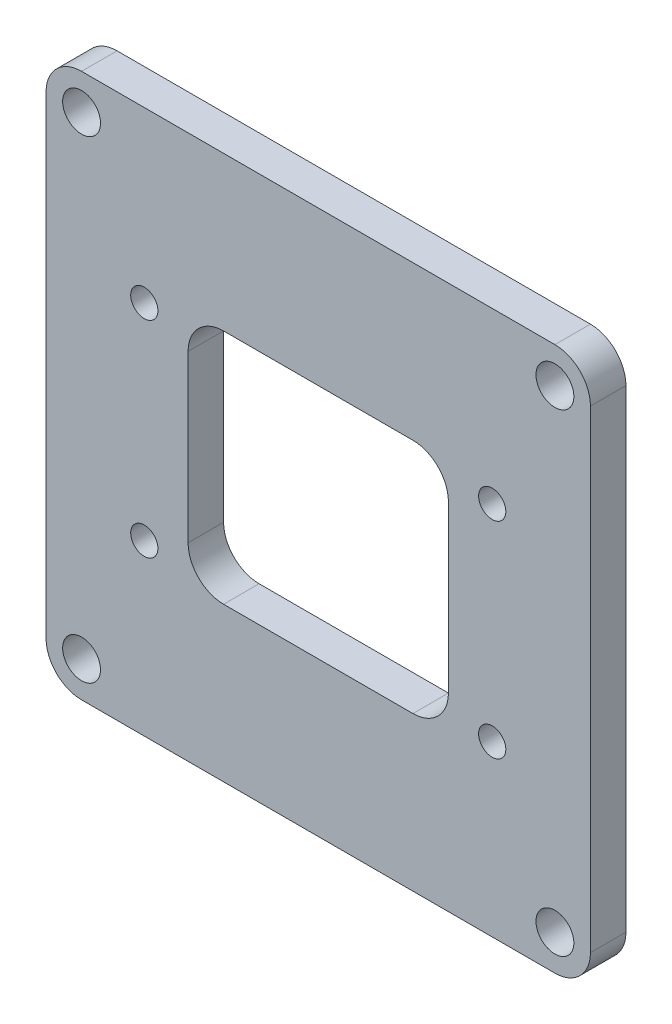
ISO-10303-21;
HEADER;
FILE_DESCRIPTION(('STEP AP214'),'2;1');
FILE_NAME('part.step','',(''),(''),'','','');
FILE_SCHEMA(('AUTOMOTIVE_DESIGN { 1 0 10303 214 1 1 1 1 }'));
ENDSEC;
DATA;
#1=APPLICATION_CONTEXT('core data for automotive mechanical design processes');
#2=APPLICATION_PROTOCOL_DEFINITION('international standard','automotive_design',2000,#1);
#3=PRODUCT_CONTEXT('',#1,'mechanical');
#4=PRODUCT('Part','Part','',(#3));
#5=PRODUCT_RELATED_PRODUCT_CATEGORY('part','',(#4));
#6=PRODUCT_DEFINITION_FORMATION('','',#4);
#7=PRODUCT_DEFINITION_CONTEXT('part definition',#1,'design');
#8=PRODUCT_DEFINITION('design','',#6,#7);
#9=PRODUCT_DEFINITION_SHAPE('','',#8);
#10=(LENGTH_UNIT() NAMED_UNIT(*) SI_UNIT(.MILLI.,.METRE.));
#11=(NAMED_UNIT(*) PLANE_ANGLE_UNIT() SI_UNIT($,.RADIAN.));
#12=(NAMED_UNIT(*) SI_UNIT($,.STERADIAN.) SOLID_ANGLE_UNIT());
#13=UNCERTAINTY_MEASURE_WITH_UNIT(LENGTH_MEASURE(1.E-05),#10,'distance_accuracy_value','');
#14=(GEOMETRIC_REPRESENTATION_CONTEXT(3) GLOBAL_UNCERTAINTY_ASSIGNED_CONTEXT((#13)) GLOBAL_UNIT_ASSIGNED_CONTEXT((#10,
#11,#12)) REPRESENTATION_CONTEXT('',''));
#15=CARTESIAN_POINT('',(0.,0.,0.));
#16=DIRECTION('',(0.,0.,1.));
#17=DIRECTION('',(1.,0.,0.));
#18=AXIS2_PLACEMENT_3D('',#15,#16,#17);
#19=CARTESIAN_POINT('',(0.,0.,3.));
#20=DIRECTION('',(0.,0.,1.));
#21=DIRECTION('',(1.,0.,0.));
#22=AXIS2_PLACEMENT_3D('',#19,#20,#21);
#23=PLANE('',#22);
#24=DIRECTION('',(0.,-1.,0.));
#25=VECTOR('',#24,1.);
#26=CARTESIAN_POINT('',(-11.,-10.,3.));
#27=LINE('',#26,#25);
#28=CARTESIAN_POINT('',(-11.,7.,3.));
#29=VERTEX_POINT('',#28);
#30=CARTESIAN_POINT('',(-11.,-7.,3.));
#31=VERTEX_POINT('',#30);
#32=EDGE_CURVE('E246',#29,#31,#27,.T.);
#33=ORIENTED_EDGE('',*,*,#32,.F.);
#34=CARTESIAN_POINT('',(-8.,7.,3.));
#35=DIRECTION('',(0.,0.,1.));
#36=DIRECTION('',(1.,0.,0.));
#37=AXIS2_PLACEMENT_3D('',#34,#35,#36);
#38=CIRCLE('',#37,3.);
#39=CARTESIAN_POINT('',(-8.,10.,3.));
#40=VERTEX_POINT('',#39);
#41=EDGE_CURVE('E42',#29,#40,#38,.F.);
#42=ORIENTED_EDGE('',*,*,#41,.T.);
#43=DIRECTION('',(-1.,0.,0.));
#44=VECTOR('',#43,1.);
#45=CARTESIAN_POINT('',(11.,10.,3.));
#46=LINE('',#45,#44);
#47=CARTESIAN_POINT('',(8.,10.,3.));
#48=VERTEX_POINT('',#47);
#49=EDGE_CURVE('E245',#48,#40,#46,.T.);
#50=ORIENTED_EDGE('',*,*,#49,.F.);
#51=CARTESIAN_POINT('',(8.,7.,3.));
#52=DIRECTION('',(0.,0.,1.));
#53=DIRECTION('',(1.,0.,0.));
#54=AXIS2_PLACEMENT_3D('',#51,#52,#53);
#55=CIRCLE('',#54,3.);
#56=CARTESIAN_POINT('',(11.,7.,3.));
#57=VERTEX_POINT('',#56);
#58=EDGE_CURVE('E229',#48,#57,#55,.F.);
#59=ORIENTED_EDGE('',*,*,#58,.T.);
#60=DIRECTION('',(0.,1.,0.));
#61=VECTOR('',#60,1.);
#62=CARTESIAN_POINT('',(11.,-10.,3.));
#63=LINE('',#62,#61);
#64=CARTESIAN_POINT('',(11.,-7.,3.));
#65=VERTEX_POINT('',#64);
#66=EDGE_CURVE('E255',#65,#57,#63,.T.);
#67=ORIENTED_EDGE('',*,*,#66,.F.);
#68=CARTESIAN_POINT('',(8.,-7.,3.));
#69=DIRECTION('',(0.,0.,1.));
#70=DIRECTION('',(1.,0.,0.));
#71=AXIS2_PLACEMENT_3D('',#68,#69,#70);
#72=CIRCLE('',#71,3.);
#73=CARTESIAN_POINT('',(8.,-10.,3.));
#74=VERTEX_POINT('',#73);
#75=EDGE_CURVE('E233',#65,#74,#72,.F.);
#76=ORIENTED_EDGE('',*,*,#75,.T.);
#77=DIRECTION('',(1.,0.,0.));
#78=VECTOR('',#77,1.);
#79=CARTESIAN_POINT('',(11.,-10.,3.));
#80=LINE('',#79,#78);
#81=CARTESIAN_POINT('',(-8.,-10.,3.));
#82=VERTEX_POINT('',#81);
#83=EDGE_CURVE('E271',#82,#74,#80,.T.);
#84=ORIENTED_EDGE('',*,*,#83,.F.);
#85=CARTESIAN_POINT('',(-8.,-7.,3.));
#86=DIRECTION('',(0.,0.,1.));
#87=DIRECTION('',(1.,0.,0.));
#88=AXIS2_PLACEMENT_3D('',#85,#86,#87);
#89=CIRCLE('',#88,3.);
#90=EDGE_CURVE('E237',#82,#31,#89,.F.);
#91=ORIENTED_EDGE('',*,*,#90,.T.);
#92=EDGE_LOOP('',(#33,#42,#50,#59,#67,#76,#84,#91));
#93=FACE_BOUND('',#92,.T.);
#94=CARTESIAN_POINT('',(14.7,-8.7,3.));
#95=DIRECTION('',(0.,0.,1.));
#96=DIRECTION('',(1.,0.,0.));
#97=AXIS2_PLACEMENT_3D('',#94,#95,#96);
#98=CIRCLE('',#97,1.15);
#99=CARTESIAN_POINT('',(15.85,-8.7,3.));
#100=VERTEX_POINT('',#99);
#101=EDGE_CURVE('E282',#100,#100,#98,.T.);
#102=ORIENTED_EDGE('',*,*,#101,.F.);
#103=EDGE_LOOP('',(#102));
#104=FACE_BOUND('',#103,.T.);
#105=CARTESIAN_POINT('',(-14.7,8.7,3.));
#106=DIRECTION('',(0.,0.,1.));
#107=DIRECTION('',(1.,0.,0.));
#108=AXIS2_PLACEMENT_3D('',#105,#106,#107);
#109=CIRCLE('',#108,1.15);
#110=CARTESIAN_POINT('',(-13.55,8.7,3.));
#111=VERTEX_POINT('',#110);
#112=EDGE_CURVE('E294',#111,#111,#109,.T.);
#113=ORIENTED_EDGE('',*,*,#112,.F.);
#114=EDGE_LOOP('',(#113));
#115=FACE_BOUND('',#114,.T.);
#116=CARTESIAN_POINT('',(20.,-20.,3.));
#117=DIRECTION('',(0.,0.,1.));
#118=DIRECTION('',(1.,0.,0.));
#119=AXIS2_PLACEMENT_3D('',#116,#117,#118);
#120=CIRCLE('',#119,1.6);
#121=CARTESIAN_POINT('',(21.6,-20.,3.));
#122=VERTEX_POINT('',#121);
#123=EDGE_CURVE('E306',#122,#122,#120,.T.);
#124=ORIENTED_EDGE('',*,*,#123,.F.);
#125=EDGE_LOOP('',(#124));
#126=FACE_BOUND('',#125,.T.);
#127=CARTESIAN_POINT('',(-20.,20.,3.));
#128=DIRECTION('',(0.,0.,1.));
#129=DIRECTION('',(1.,0.,0.));
#130=AXIS2_PLACEMENT_3D('',#127,#128,#129);
#131=CIRCLE('',#130,1.6);
#132=CARTESIAN_POINT('',(-18.4,20.,3.));
#133=VERTEX_POINT('',#132);
#134=EDGE_CURVE('E318',#133,#133,#131,.T.);
#135=ORIENTED_EDGE('',*,*,#134,.F.);
#136=EDGE_LOOP('',(#135));
#137=FACE_BOUND('',#136,.T.);
#138=DIRECTION('',(0.,1.,0.));
#139=VECTOR('',#138,1.);
#140=CARTESIAN_POINT('',(23.,-23.,3.));
#141=LINE('',#140,#139);
#142=CARTESIAN_POINT('',(23.,-20.,3.));
#143=VERTEX_POINT('',#142);
#144=CARTESIAN_POINT('',(23.,20.,3.));
#145=VERTEX_POINT('',#144);
#146=EDGE_CURVE('E326',#143,#145,#141,.T.);
#147=ORIENTED_EDGE('',*,*,#146,.T.);
#148=CARTESIAN_POINT('',(20.,20.,3.));
#149=DIRECTION('',(0.,0.,1.));
#150=DIRECTION('',(1.,0.,0.));
#151=AXIS2_PLACEMENT_3D('',#148,#149,#150);
#152=CIRCLE('',#151,3.);
#153=CARTESIAN_POINT('',(20.,23.,3.));
#154=VERTEX_POINT('',#153);
#155=EDGE_CURVE('E198',#145,#154,#152,.T.);
#156=ORIENTED_EDGE('',*,*,#155,.T.);
#157=DIRECTION('',(-1.,0.,0.));
#158=VECTOR('',#157,1.);
#159=CARTESIAN_POINT('',(23.,23.,3.));
#160=LINE('',#159,#158);
#161=CARTESIAN_POINT('',(-20.,23.,3.));
#162=VERTEX_POINT('',#161);
#163=EDGE_CURVE('E167',#154,#162,#160,.T.);
#164=ORIENTED_EDGE('',*,*,#163,.T.);
#165=CARTESIAN_POINT('',(-20.,20.,3.));
#166=DIRECTION('',(0.,0.,1.));
#167=DIRECTION('',(1.,0.,0.));
#168=AXIS2_PLACEMENT_3D('',#165,#166,#167);
#169=CIRCLE('',#168,3.);
#170=CARTESIAN_POINT('',(-23.,20.,3.));
#171=VERTEX_POINT('',#170);
#172=EDGE_CURVE('E192',#162,#171,#169,.T.);
#173=ORIENTED_EDGE('',*,*,#172,.T.);
#174=DIRECTION('',(0.,-1.,0.));
#175=VECTOR('',#174,1.);
#176=CARTESIAN_POINT('',(-23.,-23.,3.));
#177=LINE('',#176,#175);
#178=CARTESIAN_POINT('',(-23.,-20.,3.));
#179=VERTEX_POINT('',#178);
#180=EDGE_CURVE('E174',#171,#179,#177,.T.);
#181=ORIENTED_EDGE('',*,*,#180,.T.);
#182=CARTESIAN_POINT('',(-20.,-20.,3.));
#183=DIRECTION('',(0.,0.,1.));
#184=DIRECTION('',(1.,0.,0.));
#185=AXIS2_PLACEMENT_3D('',#182,#183,#184);
#186=CIRCLE('',#185,3.);
#187=CARTESIAN_POINT('',(-20.,-23.,3.));
#188=VERTEX_POINT('',#187);
#189=EDGE_CURVE('E194',#179,#188,#186,.T.);
#190=ORIENTED_EDGE('',*,*,#189,.T.);
#191=DIRECTION('',(1.,0.,0.));
#192=VECTOR('',#191,1.);
#193=CARTESIAN_POINT('',(23.,-23.,3.));
#194=LINE('',#193,#192);
#195=CARTESIAN_POINT('',(20.,-23.,3.));
#196=VERTEX_POINT('',#195);
#197=EDGE_CURVE('E178',#188,#196,#194,.T.);
#198=ORIENTED_EDGE('',*,*,#197,.T.);
#199=CARTESIAN_POINT('',(20.,-20.,3.));
#200=DIRECTION('',(0.,0.,1.));
#201=DIRECTION('',(1.,0.,0.));
#202=AXIS2_PLACEMENT_3D('',#199,#200,#201);
#203=CIRCLE('',#202,3.);
#204=EDGE_CURVE('E196',#196,#143,#203,.T.);
#205=ORIENTED_EDGE('',*,*,#204,.T.);
#206=EDGE_LOOP('',(#147,#156,#164,#173,#181,#190,#198,#205));
#207=FACE_BOUND('',#206,.T.);
#208=CARTESIAN_POINT('',(20.,20.,3.));
#209=DIRECTION('',(0.,0.,1.));
#210=DIRECTION('',(1.,0.,0.));
#211=AXIS2_PLACEMENT_3D('',#208,#209,#210);
#212=CIRCLE('',#211,1.6);
#213=CARTESIAN_POINT('',(21.6,20.,3.));
#214=VERTEX_POINT('',#213);
#215=EDGE_CURVE('E312',#214,#214,#212,.T.);
#216=ORIENTED_EDGE('',*,*,#215,.F.);
#217=EDGE_LOOP('',(#216));
#218=FACE_BOUND('',#217,.T.);
#219=CARTESIAN_POINT('',(-20.,-20.,3.));
#220=DIRECTION('',(0.,0.,1.));
#221=DIRECTION('',(1.,0.,0.));
#222=AXIS2_PLACEMENT_3D('',#219,#220,#221);
#223=CIRCLE('',#222,1.6);
#224=CARTESIAN_POINT('',(-18.4,-20.,3.));
#225=VERTEX_POINT('',#224);
#226=EDGE_CURVE('E300',#225,#225,#223,.T.);
#227=ORIENTED_EDGE('',*,*,#226,.F.);
#228=EDGE_LOOP('',(#227));
#229=FACE_BOUND('',#228,.T.);
#230=CARTESIAN_POINT('',(14.7,8.7,3.));
#231=DIRECTION('',(0.,0.,1.));
#232=DIRECTION('',(1.,0.,0.));
#233=AXIS2_PLACEMENT_3D('',#230,#231,#232);
#234=CIRCLE('',#233,1.15);
#235=CARTESIAN_POINT('',(15.85,8.7,3.));
#236=VERTEX_POINT('',#235);
#237=EDGE_CURVE('E288',#236,#236,#234,.T.);
#238=ORIENTED_EDGE('',*,*,#237,.F.);
#239=EDGE_LOOP('',(#238));
#240=FACE_BOUND('',#239,.T.);
#241=CARTESIAN_POINT('',(-14.7,-8.7,3.));
#242=DIRECTION('',(0.,0.,1.));
#243=DIRECTION('',(1.,0.,0.));
#244=AXIS2_PLACEMENT_3D('',#241,#242,#243);
#245=CIRCLE('',#244,1.15);
#246=CARTESIAN_POINT('',(-13.55,-8.7,3.));
#247=VERTEX_POINT('',#246);
#248=EDGE_CURVE('E276',#247,#247,#245,.T.);
#249=ORIENTED_EDGE('',*,*,#248,.F.);
#250=EDGE_LOOP('',(#249));
#251=FACE_BOUND('',#250,.T.);
#252=ADVANCED_FACE('F34',(#93,#104,#115,#126,#137,#207,#218,#229,#240,#251),#23,.T.);
#253=CARTESIAN_POINT('',(0.,0.,0.));
#254=DIRECTION('',(0.,0.,1.));
#255=DIRECTION('',(1.,0.,0.));
#256=AXIS2_PLACEMENT_3D('',#253,#254,#255);
#257=PLANE('',#256);
#258=DIRECTION('',(0.,1.,0.));
#259=VECTOR('',#258,1.);
#260=CARTESIAN_POINT('',(11.,-10.,0.));
#261=LINE('',#260,#259);
#262=CARTESIAN_POINT('',(11.,-7.,0.));
#263=VERTEX_POINT('',#262);
#264=CARTESIAN_POINT('',(11.,7.,0.));
#265=VERTEX_POINT('',#264);
#266=EDGE_CURVE('E262',#263,#265,#261,.T.);
#267=ORIENTED_EDGE('',*,*,#266,.T.);
#268=CARTESIAN_POINT('',(8.,7.,0.));
#269=DIRECTION('',(0.,0.,1.));
#270=DIRECTION('',(1.,0.,0.));
#271=AXIS2_PLACEMENT_3D('',#268,#269,#270);
#272=CIRCLE('',#271,3.);
#273=CARTESIAN_POINT('',(8.,10.,0.));
#274=VERTEX_POINT('',#273);
#275=EDGE_CURVE('E231',#265,#274,#272,.T.);
#276=ORIENTED_EDGE('',*,*,#275,.T.);
#277=DIRECTION('',(-1.,0.,0.));
#278=VECTOR('',#277,1.);
#279=CARTESIAN_POINT('',(11.,10.,0.));
#280=LINE('',#279,#278);
#281=CARTESIAN_POINT('',(-8.,10.,0.));
#282=VERTEX_POINT('',#281);
#283=EDGE_CURVE('E267',#274,#282,#280,.T.);
#284=ORIENTED_EDGE('',*,*,#283,.T.);
#285=CARTESIAN_POINT('',(-8.,7.,0.));
#286=DIRECTION('',(0.,0.,1.));
#287=DIRECTION('',(1.,0.,0.));
#288=AXIS2_PLACEMENT_3D('',#285,#286,#287);
#289=CIRCLE('',#288,3.);
#290=CARTESIAN_POINT('',(-11.,7.,0.));
#291=VERTEX_POINT('',#290);
#292=EDGE_CURVE('E11',#282,#291,#289,.T.);
#293=ORIENTED_EDGE('',*,*,#292,.T.);
#294=DIRECTION('',(0.,-1.,0.));
#295=VECTOR('',#294,1.);
#296=CARTESIAN_POINT('',(-11.,-10.,0.));
#297=LINE('',#296,#295);
#298=CARTESIAN_POINT('',(-11.,-7.,0.));
#299=VERTEX_POINT('',#298);
#300=EDGE_CURVE('E254',#291,#299,#297,.T.);
#301=ORIENTED_EDGE('',*,*,#300,.T.);
#302=CARTESIAN_POINT('',(-8.,-7.,0.));
#303=DIRECTION('',(0.,0.,1.));
#304=DIRECTION('',(1.,0.,0.));
#305=AXIS2_PLACEMENT_3D('',#302,#303,#304);
#306=CIRCLE('',#305,3.);
#307=CARTESIAN_POINT('',(-8.,-10.,0.));
#308=VERTEX_POINT('',#307);
#309=EDGE_CURVE('E239',#299,#308,#306,.T.);
#310=ORIENTED_EDGE('',*,*,#309,.T.);
#311=DIRECTION('',(1.,0.,0.));
#312=VECTOR('',#311,1.);
#313=CARTESIAN_POINT('',(11.,-10.,0.));
#314=LINE('',#313,#312);
#315=CARTESIAN_POINT('',(8.,-10.,0.));
#316=VERTEX_POINT('',#315);
#317=EDGE_CURVE('E259',#308,#316,#314,.T.);
#318=ORIENTED_EDGE('',*,*,#317,.T.);
#319=CARTESIAN_POINT('',(8.,-7.,0.));
#320=DIRECTION('',(0.,0.,1.));
#321=DIRECTION('',(1.,0.,0.));
#322=AXIS2_PLACEMENT_3D('',#319,#320,#321);
#323=CIRCLE('',#322,3.);
#324=EDGE_CURVE('E235',#316,#263,#323,.T.);
#325=ORIENTED_EDGE('',*,*,#324,.T.);
#326=EDGE_LOOP('',(#267,#276,#284,#293,#301,#310,#318,#325));
#327=FACE_BOUND('',#326,.T.);
#328=DIRECTION('',(-1.,0.,0.));
#329=VECTOR('',#328,1.);
#330=CARTESIAN_POINT('',(23.,23.,0.));
#331=LINE('',#330,#329);
#332=CARTESIAN_POINT('',(20.,23.,0.));
#333=VERTEX_POINT('',#332);
#334=CARTESIAN_POINT('',(-20.,23.,0.));
#335=VERTEX_POINT('',#334);
#336=EDGE_CURVE('E164',#333,#335,#331,.T.);
#337=ORIENTED_EDGE('',*,*,#336,.F.);
#338=CARTESIAN_POINT('',(20.,20.,0.));
#339=DIRECTION('',(0.,0.,1.));
#340=DIRECTION('',(1.,0.,0.));
#341=AXIS2_PLACEMENT_3D('',#338,#339,#340);
#342=CIRCLE('',#341,3.);
#343=CARTESIAN_POINT('',(23.,20.,0.));
#344=VERTEX_POINT('',#343);
#345=EDGE_CURVE('E147',#333,#344,#342,.F.);
#346=ORIENTED_EDGE('',*,*,#345,.T.);
#347=DIRECTION('',(0.,1.,0.));
#348=VECTOR('',#347,1.);
#349=CARTESIAN_POINT('',(23.,-23.,0.));
#350=LINE('',#349,#348);
#351=CARTESIAN_POINT('',(23.,-20.,0.));
#352=VERTEX_POINT('',#351);
#353=EDGE_CURVE('E175',#352,#344,#350,.T.);
#354=ORIENTED_EDGE('',*,*,#353,.F.);
#355=CARTESIAN_POINT('',(20.,-20.,0.));
#356=DIRECTION('',(0.,0.,1.));
#357=DIRECTION('',(1.,0.,0.));
#358=AXIS2_PLACEMENT_3D('',#355,#356,#357);
#359=CIRCLE('',#358,3.);
#360=CARTESIAN_POINT('',(20.,-23.,0.));
#361=VERTEX_POINT('',#360);
#362=EDGE_CURVE('E158',#352,#361,#359,.F.);
#363=ORIENTED_EDGE('',*,*,#362,.T.);
#364=DIRECTION('',(1.,0.,0.));
#365=VECTOR('',#364,1.);
#366=CARTESIAN_POINT('',(23.,-23.,0.));
#367=LINE('',#366,#365);
#368=CARTESIAN_POINT('',(-20.,-23.,0.));
#369=VERTEX_POINT('',#368);
#370=EDGE_CURVE('E180',#369,#361,#367,.T.);
#371=ORIENTED_EDGE('',*,*,#370,.F.);
#372=CARTESIAN_POINT('',(-20.,-20.,0.));
#373=DIRECTION('',(0.,0.,1.));
#374=DIRECTION('',(1.,0.,0.));
#375=AXIS2_PLACEMENT_3D('',#372,#373,#374);
#376=CIRCLE('',#375,3.);
#377=CARTESIAN_POINT('',(-23.,-20.,0.));
#378=VERTEX_POINT('',#377);
#379=EDGE_CURVE('E186',#369,#378,#376,.F.);
#380=ORIENTED_EDGE('',*,*,#379,.T.);
#381=DIRECTION('',(0.,-1.,0.));
#382=VECTOR('',#381,1.);
#383=CARTESIAN_POINT('',(-23.,-23.,0.));
#384=LINE('',#383,#382);
#385=CARTESIAN_POINT('',(-23.,20.,0.));
#386=VERTEX_POINT('',#385);
#387=EDGE_CURVE('E321',#386,#378,#384,.T.);
#388=ORIENTED_EDGE('',*,*,#387,.F.);
#389=CARTESIAN_POINT('',(-20.,20.,0.));
#390=DIRECTION('',(0.,0.,1.));
#391=DIRECTION('',(1.,0.,0.));
#392=AXIS2_PLACEMENT_3D('',#389,#390,#391);
#393=CIRCLE('',#392,3.);
#394=EDGE_CURVE('E168',#386,#335,#393,.F.);
#395=ORIENTED_EDGE('',*,*,#394,.T.);
#396=EDGE_LOOP('',(#337,#346,#354,#363,#371,#380,#388,#395));
#397=FACE_BOUND('',#396,.T.);
#398=CARTESIAN_POINT('',(-20.,20.,0.));
#399=DIRECTION('',(0.,0.,1.));
#400=DIRECTION('',(1.,0.,0.));
#401=AXIS2_PLACEMENT_3D('',#398,#399,#400);
#402=CIRCLE('',#401,1.6);
#403=CARTESIAN_POINT('',(-18.4,20.,0.));
#404=VERTEX_POINT('',#403);
#405=EDGE_CURVE('E315',#404,#404,#402,.T.);
#406=ORIENTED_EDGE('',*,*,#405,.T.);
#407=EDGE_LOOP('',(#406));
#408=FACE_BOUND('',#407,.T.);
#409=CARTESIAN_POINT('',(20.,20.,0.));
#410=DIRECTION('',(0.,0.,1.));
#411=DIRECTION('',(1.,0.,0.));
#412=AXIS2_PLACEMENT_3D('',#409,#410,#411);
#413=CIRCLE('',#412,1.6);
#414=CARTESIAN_POINT('',(21.6,20.,0.));
#415=VERTEX_POINT('',#414);
#416=EDGE_CURVE('E309',#415,#415,#413,.T.);
#417=ORIENTED_EDGE('',*,*,#416,.T.);
#418=EDGE_LOOP('',(#417));
#419=FACE_BOUND('',#418,.T.);
#420=CARTESIAN_POINT('',(20.,-20.,0.));
#421=DIRECTION('',(0.,0.,1.));
#422=DIRECTION('',(1.,0.,0.));
#423=AXIS2_PLACEMENT_3D('',#420,#421,#422);
#424=CIRCLE('',#423,1.6);
#425=CARTESIAN_POINT('',(21.6,-20.,0.));
#426=VERTEX_POINT('',#425);
#427=EDGE_CURVE('E303',#426,#426,#424,.T.);
#428=ORIENTED_EDGE('',*,*,#427,.T.);
#429=EDGE_LOOP('',(#428));
#430=FACE_BOUND('',#429,.T.);
#431=CARTESIAN_POINT('',(-20.,-20.,0.));
#432=DIRECTION('',(0.,0.,1.));
#433=DIRECTION('',(1.,0.,0.));
#434=AXIS2_PLACEMENT_3D('',#431,#432,#433);
#435=CIRCLE('',#434,1.6);
#436=CARTESIAN_POINT('',(-18.4,-20.,0.));
#437=VERTEX_POINT('',#436);
#438=EDGE_CURVE('E297',#437,#437,#435,.T.);
#439=ORIENTED_EDGE('',*,*,#438,.T.);
#440=EDGE_LOOP('',(#439));
#441=FACE_BOUND('',#440,.T.);
#442=CARTESIAN_POINT('',(-14.7,8.7,0.));
#443=DIRECTION('',(0.,0.,1.));
#444=DIRECTION('',(1.,0.,0.));
#445=AXIS2_PLACEMENT_3D('',#442,#443,#444);
#446=CIRCLE('',#445,1.15);
#447=CARTESIAN_POINT('',(-13.55,8.7,0.));
#448=VERTEX_POINT('',#447);
#449=EDGE_CURVE('E291',#448,#448,#446,.T.);
#450=ORIENTED_EDGE('',*,*,#449,.T.);
#451=EDGE_LOOP('',(#450));
#452=FACE_BOUND('',#451,.T.);
#453=CARTESIAN_POINT('',(14.7,8.7,0.));
#454=DIRECTION('',(0.,0.,1.));
#455=DIRECTION('',(1.,0.,0.));
#456=AXIS2_PLACEMENT_3D('',#453,#454,#455);
#457=CIRCLE('',#456,1.15);
#458=CARTESIAN_POINT('',(15.85,8.7,0.));
#459=VERTEX_POINT('',#458);
#460=EDGE_CURVE('E285',#459,#459,#457,.T.);
#461=ORIENTED_EDGE('',*,*,#460,.T.);
#462=EDGE_LOOP('',(#461));
#463=FACE_BOUND('',#462,.T.);
#464=CARTESIAN_POINT('',(14.7,-8.7,0.));
#465=DIRECTION('',(0.,0.,1.));
#466=DIRECTION('',(1.,0.,0.));
#467=AXIS2_PLACEMENT_3D('',#464,#465,#466);
#468=CIRCLE('',#467,1.15);
#469=CARTESIAN_POINT('',(15.85,-8.7,0.));
#470=VERTEX_POINT('',#469);
#471=EDGE_CURVE('E279',#470,#470,#468,.T.);
#472=ORIENTED_EDGE('',*,*,#471,.T.);
#473=EDGE_LOOP('',(#472));
#474=FACE_BOUND('',#473,.T.);
#475=CARTESIAN_POINT('',(-14.7,-8.7,0.));
#476=DIRECTION('',(0.,0.,1.));
#477=DIRECTION('',(1.,0.,0.));
#478=AXIS2_PLACEMENT_3D('',#475,#476,#477);
#479=CIRCLE('',#478,1.15);
#480=CARTESIAN_POINT('',(-13.55,-8.7,0.));
#481=VERTEX_POINT('',#480);
#482=EDGE_CURVE('E269',#481,#481,#479,.T.);
#483=ORIENTED_EDGE('',*,*,#482,.T.);
#484=EDGE_LOOP('',(#483));
#485=FACE_BOUND('',#484,.T.);
#486=ADVANCED_FACE('F171',(#327,#397,#408,#419,#430,#441,#452,#463,#474,#485),#257,.F.);
#487=CARTESIAN_POINT('',(-23.,-23.,3.));
#488=DIRECTION('',(1.,0.,0.));
#489=DIRECTION('',(0.,0.,-1.));
#490=AXIS2_PLACEMENT_3D('',#487,#488,#489);
#491=PLANE('',#490);
#492=ORIENTED_EDGE('',*,*,#387,.T.);
#493=DIRECTION('',(0.,0.,-1.));
#494=VECTOR('',#493,1.);
#495=CARTESIAN_POINT('',(-23.,-20.,3.));
#496=LINE('',#495,#494);
#497=EDGE_CURVE('E208',#378,#179,#496,.F.);
#498=ORIENTED_EDGE('',*,*,#497,.T.);
#499=ORIENTED_EDGE('',*,*,#180,.F.);
#500=DIRECTION('',(0.,0.,-1.));
#501=VECTOR('',#500,1.);
#502=CARTESIAN_POINT('',(-23.,20.,3.));
#503=LINE('',#502,#501);
#504=EDGE_CURVE('E205',#171,#386,#503,.T.);
#505=ORIENTED_EDGE('',*,*,#504,.T.);
#506=EDGE_LOOP('',(#492,#498,#499,#505));
#507=FACE_BOUND('',#506,.T.);
#508=ADVANCED_FACE('F355',(#507),#491,.F.);
#509=CARTESIAN_POINT('',(23.,-23.,3.));
#510=DIRECTION('',(0.,1.,0.));
#511=DIRECTION('',(-1.,0.,0.));
#512=AXIS2_PLACEMENT_3D('',#509,#510,#511);
#513=PLANE('',#512);
#514=ORIENTED_EDGE('',*,*,#370,.T.);
#515=DIRECTION('',(0.,0.,-1.));
#516=VECTOR('',#515,1.);
#517=CARTESIAN_POINT('',(20.,-23.,3.));
#518=LINE('',#517,#516);
#519=EDGE_CURVE('E203',#361,#196,#518,.F.);
#520=ORIENTED_EDGE('',*,*,#519,.T.);
#521=ORIENTED_EDGE('',*,*,#197,.F.);
#522=DIRECTION('',(0.,0.,-1.));
#523=VECTOR('',#522,1.);
#524=CARTESIAN_POINT('',(-20.,-23.,3.));
#525=LINE('',#524,#523);
#526=EDGE_CURVE('E200',#188,#369,#525,.T.);
#527=ORIENTED_EDGE('',*,*,#526,.T.);
#528=EDGE_LOOP('',(#514,#520,#521,#527));
#529=FACE_BOUND('',#528,.T.);
#530=ADVANCED_FACE('F335',(#529),#513,.F.);
#531=CARTESIAN_POINT('',(23.,-23.,3.));
#532=DIRECTION('',(-1.,0.,0.));
#533=DIRECTION('',(0.,0.,1.));
#534=AXIS2_PLACEMENT_3D('',#531,#532,#533);
#535=PLANE('',#534);
#536=ORIENTED_EDGE('',*,*,#353,.T.);
#537=DIRECTION('',(0.,0.,-1.));
#538=VECTOR('',#537,1.);
#539=CARTESIAN_POINT('',(23.,20.,3.));
#540=LINE('',#539,#538);
#541=EDGE_CURVE('E152',#344,#145,#540,.F.);
#542=ORIENTED_EDGE('',*,*,#541,.T.);
#543=ORIENTED_EDGE('',*,*,#146,.F.);
#544=DIRECTION('',(0.,0.,-1.));
#545=VECTOR('',#544,1.);
#546=CARTESIAN_POINT('',(23.,-20.,3.));
#547=LINE('',#546,#545);
#548=EDGE_CURVE('E157',#143,#352,#547,.T.);
#549=ORIENTED_EDGE('',*,*,#548,.T.);
#550=EDGE_LOOP('',(#536,#542,#543,#549));
#551=FACE_BOUND('',#550,.T.);
#552=ADVANCED_FACE('F346',(#551),#535,.F.);
#553=CARTESIAN_POINT('',(23.,23.,3.));
#554=DIRECTION('',(0.,-1.,0.));
#555=DIRECTION('',(1.,0.,0.));
#556=AXIS2_PLACEMENT_3D('',#553,#554,#555);
#557=PLANE('',#556);
#558=ORIENTED_EDGE('',*,*,#163,.F.);
#559=DIRECTION('',(0.,0.,-1.));
#560=VECTOR('',#559,1.);
#561=CARTESIAN_POINT('',(20.,23.,3.));
#562=LINE('',#561,#560);
#563=EDGE_CURVE('E151',#154,#333,#562,.T.);
#564=ORIENTED_EDGE('',*,*,#563,.T.);
#565=ORIENTED_EDGE('',*,*,#336,.T.);
#566=DIRECTION('',(0.,0.,-1.));
#567=VECTOR('',#566,1.);
#568=CARTESIAN_POINT('',(-20.,23.,3.));
#569=LINE('',#568,#567);
#570=EDGE_CURVE('E169',#335,#162,#569,.F.);
#571=ORIENTED_EDGE('',*,*,#570,.T.);
#572=EDGE_LOOP('',(#558,#564,#565,#571));
#573=FACE_BOUND('',#572,.T.);
#574=ADVANCED_FACE('F163',(#573),#557,.F.);
#575=CARTESIAN_POINT('',(-20.,20.,3.));
#576=DIRECTION('',(0.,0.,-1.));
#577=DIRECTION('',(-1.,0.,0.));
#578=AXIS2_PLACEMENT_3D('',#575,#576,#577);
#579=CYLINDRICAL_SURFACE('',#578,1.6);
#580=ORIENTED_EDGE('',*,*,#134,.T.);
#581=EDGE_LOOP('',(#580));
#582=FACE_BOUND('',#581,.T.);
#583=ORIENTED_EDGE('',*,*,#405,.F.);
#584=EDGE_LOOP('',(#583));
#585=FACE_BOUND('',#584,.T.);
#586=ADVANCED_FACE('F353',(#582,#585),#579,.F.);
#587=CARTESIAN_POINT('',(20.,20.,3.));
#588=DIRECTION('',(0.,0.,-1.));
#589=DIRECTION('',(-1.,0.,0.));
#590=AXIS2_PLACEMENT_3D('',#587,#588,#589);
#591=CYLINDRICAL_SURFACE('',#590,1.6);
#592=ORIENTED_EDGE('',*,*,#215,.T.);
#593=EDGE_LOOP('',(#592));
#594=FACE_BOUND('',#593,.T.);
#595=ORIENTED_EDGE('',*,*,#416,.F.);
#596=EDGE_LOOP('',(#595));
#597=FACE_BOUND('',#596,.T.);
#598=ADVANCED_FACE('F366',(#594,#597),#591,.F.);
#599=CARTESIAN_POINT('',(20.,-20.,3.));
#600=DIRECTION('',(0.,0.,-1.));
#601=DIRECTION('',(-1.,0.,0.));
#602=AXIS2_PLACEMENT_3D('',#599,#600,#601);
#603=CYLINDRICAL_SURFACE('',#602,1.6);
#604=ORIENTED_EDGE('',*,*,#123,.T.);
#605=EDGE_LOOP('',(#604));
#606=FACE_BOUND('',#605,.T.);
#607=ORIENTED_EDGE('',*,*,#427,.F.);
#608=EDGE_LOOP('',(#607));
#609=FACE_BOUND('',#608,.T.);
#610=ADVANCED_FACE('F370',(#606,#609),#603,.F.);
#611=CARTESIAN_POINT('',(-20.,-20.,3.));
#612=DIRECTION('',(0.,0.,-1.));
#613=DIRECTION('',(-1.,0.,0.));
#614=AXIS2_PLACEMENT_3D('',#611,#612,#613);
#615=CYLINDRICAL_SURFACE('',#614,1.6);
#616=ORIENTED_EDGE('',*,*,#226,.T.);
#617=EDGE_LOOP('',(#616));
#618=FACE_BOUND('',#617,.T.);
#619=ORIENTED_EDGE('',*,*,#438,.F.);
#620=EDGE_LOOP('',(#619));
#621=FACE_BOUND('',#620,.T.);
#622=ADVANCED_FACE('F374',(#618,#621),#615,.F.);
#623=CARTESIAN_POINT('',(-14.7,8.7,3.));
#624=DIRECTION('',(0.,0.,-1.));
#625=DIRECTION('',(-1.,0.,0.));
#626=AXIS2_PLACEMENT_3D('',#623,#624,#625);
#627=CYLINDRICAL_SURFACE('',#626,1.15);
#628=ORIENTED_EDGE('',*,*,#112,.T.);
#629=EDGE_LOOP('',(#628));
#630=FACE_BOUND('',#629,.T.);
#631=ORIENTED_EDGE('',*,*,#449,.F.);
#632=EDGE_LOOP('',(#631));
#633=FACE_BOUND('',#632,.T.);
#634=ADVANCED_FACE('F378',(#630,#633),#627,.F.);
#635=CARTESIAN_POINT('',(14.7,8.7,3.));
#636=DIRECTION('',(0.,0.,-1.));
#637=DIRECTION('',(-1.,0.,0.));
#638=AXIS2_PLACEMENT_3D('',#635,#636,#637);
#639=CYLINDRICAL_SURFACE('',#638,1.15);
#640=ORIENTED_EDGE('',*,*,#237,.T.);
#641=EDGE_LOOP('',(#640));
#642=FACE_BOUND('',#641,.T.);
#643=ORIENTED_EDGE('',*,*,#460,.F.);
#644=EDGE_LOOP('',(#643));
#645=FACE_BOUND('',#644,.T.);
#646=ADVANCED_FACE('F382',(#642,#645),#639,.F.);
#647=CARTESIAN_POINT('',(14.7,-8.7,3.));
#648=DIRECTION('',(0.,0.,-1.));
#649=DIRECTION('',(-1.,0.,0.));
#650=AXIS2_PLACEMENT_3D('',#647,#648,#649);
#651=CYLINDRICAL_SURFACE('',#650,1.15);
#652=ORIENTED_EDGE('',*,*,#101,.T.);
#653=EDGE_LOOP('',(#652));
#654=FACE_BOUND('',#653,.T.);
#655=ORIENTED_EDGE('',*,*,#471,.F.);
#656=EDGE_LOOP('',(#655));
#657=FACE_BOUND('',#656,.T.);
#658=ADVANCED_FACE('F386',(#654,#657),#651,.F.);
#659=CARTESIAN_POINT('',(-14.7,-8.7,3.));
#660=DIRECTION('',(0.,0.,-1.));
#661=DIRECTION('',(-1.,0.,0.));
#662=AXIS2_PLACEMENT_3D('',#659,#660,#661);
#663=CYLINDRICAL_SURFACE('',#662,1.15);
#664=ORIENTED_EDGE('',*,*,#248,.T.);
#665=EDGE_LOOP('',(#664));
#666=FACE_BOUND('',#665,.T.);
#667=ORIENTED_EDGE('',*,*,#482,.F.);
#668=EDGE_LOOP('',(#667));
#669=FACE_BOUND('',#668,.T.);
#670=ADVANCED_FACE('F390',(#666,#669),#663,.F.);
#671=CARTESIAN_POINT('',(20.,20.,3.));
#672=DIRECTION('',(0.,0.,-1.));
#673=DIRECTION('',(-1.,0.,0.));
#674=AXIS2_PLACEMENT_3D('',#671,#672,#673);
#675=CYLINDRICAL_SURFACE('',#674,3.);
#676=ORIENTED_EDGE('',*,*,#155,.F.);
#677=ORIENTED_EDGE('',*,*,#541,.F.);
#678=ORIENTED_EDGE('',*,*,#345,.F.);
#679=ORIENTED_EDGE('',*,*,#563,.F.);
#680=EDGE_LOOP('',(#676,#677,#678,#679));
#681=FACE_BOUND('',#680,.T.);
#682=ADVANCED_FACE('F150',(#681),#675,.T.);
#683=CARTESIAN_POINT('',(20.,-20.,3.));
#684=DIRECTION('',(0.,0.,-1.));
#685=DIRECTION('',(-1.,0.,0.));
#686=AXIS2_PLACEMENT_3D('',#683,#684,#685);
#687=CYLINDRICAL_SURFACE('',#686,3.);
#688=ORIENTED_EDGE('',*,*,#204,.F.);
#689=ORIENTED_EDGE('',*,*,#519,.F.);
#690=ORIENTED_EDGE('',*,*,#362,.F.);
#691=ORIENTED_EDGE('',*,*,#548,.F.);
#692=EDGE_LOOP('',(#688,#689,#690,#691));
#693=FACE_BOUND('',#692,.T.);
#694=ADVANCED_FACE('F340',(#693),#687,.T.);
#695=CARTESIAN_POINT('',(-20.,-20.,3.));
#696=DIRECTION('',(0.,0.,-1.));
#697=DIRECTION('',(-1.,0.,0.));
#698=AXIS2_PLACEMENT_3D('',#695,#696,#697);
#699=CYLINDRICAL_SURFACE('',#698,3.);
#700=ORIENTED_EDGE('',*,*,#189,.F.);
#701=ORIENTED_EDGE('',*,*,#497,.F.);
#702=ORIENTED_EDGE('',*,*,#379,.F.);
#703=ORIENTED_EDGE('',*,*,#526,.F.);
#704=EDGE_LOOP('',(#700,#701,#702,#703));
#705=FACE_BOUND('',#704,.T.);
#706=ADVANCED_FACE('F474',(#705),#699,.T.);
#707=CARTESIAN_POINT('',(-20.,20.,3.));
#708=DIRECTION('',(0.,0.,-1.));
#709=DIRECTION('',(-1.,0.,0.));
#710=AXIS2_PLACEMENT_3D('',#707,#708,#709);
#711=CYLINDRICAL_SURFACE('',#710,3.);
#712=ORIENTED_EDGE('',*,*,#172,.F.);
#713=ORIENTED_EDGE('',*,*,#570,.F.);
#714=ORIENTED_EDGE('',*,*,#394,.F.);
#715=ORIENTED_EDGE('',*,*,#504,.F.);
#716=EDGE_LOOP('',(#712,#713,#714,#715));
#717=FACE_BOUND('',#716,.T.);
#718=ADVANCED_FACE('F397',(#717),#711,.T.);
#719=CARTESIAN_POINT('',(-11.,-10.,0.));
#720=DIRECTION('',(-1.,0.,0.));
#721=DIRECTION('',(0.,0.,1.));
#722=AXIS2_PLACEMENT_3D('',#719,#720,#721);
#723=PLANE('',#722);
#724=ORIENTED_EDGE('',*,*,#32,.T.);
#725=DIRECTION('',(0.,0.,1.));
#726=VECTOR('',#725,1.);
#727=CARTESIAN_POINT('',(-11.,-7.,0.));
#728=LINE('',#727,#726);
#729=EDGE_CURVE('E49',#31,#299,#728,.F.);
#730=ORIENTED_EDGE('',*,*,#729,.T.);
#731=ORIENTED_EDGE('',*,*,#300,.F.);
#732=DIRECTION('',(0.,0.,1.));
#733=VECTOR('',#732,1.);
#734=CARTESIAN_POINT('',(-11.,7.,3.));
#735=LINE('',#734,#733);
#736=EDGE_CURVE('E225',#291,#29,#735,.T.);
#737=ORIENTED_EDGE('',*,*,#736,.T.);
#738=EDGE_LOOP('',(#724,#730,#731,#737));
#739=FACE_BOUND('',#738,.T.);
#740=ADVANCED_FACE('F257',(#739),#723,.F.);
#741=CARTESIAN_POINT('',(11.,10.,0.));
#742=DIRECTION('',(0.,1.,0.));
#743=DIRECTION('',(0.,0.,1.));
#744=AXIS2_PLACEMENT_3D('',#741,#742,#743);
#745=PLANE('',#744);
#746=ORIENTED_EDGE('',*,*,#283,.F.);
#747=DIRECTION('',(0.,0.,1.));
#748=VECTOR('',#747,1.);
#749=CARTESIAN_POINT('',(8.,10.,3.));
#750=LINE('',#749,#748);
#751=EDGE_CURVE('E212',#274,#48,#750,.T.);
#752=ORIENTED_EDGE('',*,*,#751,.T.);
#753=ORIENTED_EDGE('',*,*,#49,.T.);
#754=DIRECTION('',(0.,0.,1.));
#755=VECTOR('',#754,1.);
#756=CARTESIAN_POINT('',(-8.,10.,0.));
#757=LINE('',#756,#755);
#758=EDGE_CURVE('E210',#40,#282,#757,.F.);
#759=ORIENTED_EDGE('',*,*,#758,.T.);
#760=EDGE_LOOP('',(#746,#752,#753,#759));
#761=FACE_BOUND('',#760,.T.);
#762=ADVANCED_FACE('F252',(#761),#745,.F.);
#763=CARTESIAN_POINT('',(11.,-10.,0.));
#764=DIRECTION('',(1.,0.,0.));
#765=DIRECTION('',(0.,0.,-1.));
#766=AXIS2_PLACEMENT_3D('',#763,#764,#765);
#767=PLANE('',#766);
#768=ORIENTED_EDGE('',*,*,#66,.T.);
#769=DIRECTION('',(0.,0.,1.));
#770=VECTOR('',#769,1.);
#771=CARTESIAN_POINT('',(11.,7.,0.));
#772=LINE('',#771,#770);
#773=EDGE_CURVE('E218',#57,#265,#772,.F.);
#774=ORIENTED_EDGE('',*,*,#773,.T.);
#775=ORIENTED_EDGE('',*,*,#266,.F.);
#776=DIRECTION('',(0.,0.,1.));
#777=VECTOR('',#776,1.);
#778=CARTESIAN_POINT('',(11.,-7.,3.));
#779=LINE('',#778,#777);
#780=EDGE_CURVE('E215',#263,#65,#779,.T.);
#781=ORIENTED_EDGE('',*,*,#780,.T.);
#782=EDGE_LOOP('',(#768,#774,#775,#781));
#783=FACE_BOUND('',#782,.T.);
#784=ADVANCED_FACE('F402',(#783),#767,.F.);
#785=CARTESIAN_POINT('',(11.,-10.,0.));
#786=DIRECTION('',(0.,-1.,0.));
#787=DIRECTION('',(0.,0.,-1.));
#788=AXIS2_PLACEMENT_3D('',#785,#786,#787);
#789=PLANE('',#788);
#790=ORIENTED_EDGE('',*,*,#83,.T.);
#791=DIRECTION('',(0.,0.,1.));
#792=VECTOR('',#791,1.);
#793=CARTESIAN_POINT('',(8.,-10.,0.));
#794=LINE('',#793,#792);
#795=EDGE_CURVE('E223',#74,#316,#794,.F.);
#796=ORIENTED_EDGE('',*,*,#795,.T.);
#797=ORIENTED_EDGE('',*,*,#317,.F.);
#798=DIRECTION('',(0.,0.,1.));
#799=VECTOR('',#798,1.);
#800=CARTESIAN_POINT('',(-8.,-10.,3.));
#801=LINE('',#800,#799);
#802=EDGE_CURVE('E220',#308,#82,#801,.T.);
#803=ORIENTED_EDGE('',*,*,#802,.T.);
#804=EDGE_LOOP('',(#790,#796,#797,#803));
#805=FACE_BOUND('',#804,.T.);
#806=ADVANCED_FACE('F398',(#805),#789,.F.);
#807=CARTESIAN_POINT('',(8.,7.,0.));
#808=DIRECTION('',(0.,0.,-1.));
#809=DIRECTION('',(-1.,0.,0.));
#810=AXIS2_PLACEMENT_3D('',#807,#808,#809);
#811=CYLINDRICAL_SURFACE('',#810,3.);
#812=ORIENTED_EDGE('',*,*,#275,.F.);
#813=ORIENTED_EDGE('',*,*,#773,.F.);
#814=ORIENTED_EDGE('',*,*,#58,.F.);
#815=ORIENTED_EDGE('',*,*,#751,.F.);
#816=EDGE_LOOP('',(#812,#813,#814,#815));
#817=FACE_BOUND('',#816,.T.);
#818=ADVANCED_FACE('F401',(#817),#811,.F.);
#819=CARTESIAN_POINT('',(8.,-7.,0.));
#820=DIRECTION('',(0.,0.,-1.));
#821=DIRECTION('',(-1.,0.,0.));
#822=AXIS2_PLACEMENT_3D('',#819,#820,#821);
#823=CYLINDRICAL_SURFACE('',#822,3.);
#824=ORIENTED_EDGE('',*,*,#324,.F.);
#825=ORIENTED_EDGE('',*,*,#795,.F.);
#826=ORIENTED_EDGE('',*,*,#75,.F.);
#827=ORIENTED_EDGE('',*,*,#780,.F.);
#828=EDGE_LOOP('',(#824,#825,#826,#827));
#829=FACE_BOUND('',#828,.T.);
#830=ADVANCED_FACE('F427',(#829),#823,.F.);
#831=CARTESIAN_POINT('',(-8.,-7.,0.));
#832=DIRECTION('',(0.,0.,-1.));
#833=DIRECTION('',(-1.,0.,0.));
#834=AXIS2_PLACEMENT_3D('',#831,#832,#833);
#835=CYLINDRICAL_SURFACE('',#834,3.);
#836=ORIENTED_EDGE('',*,*,#309,.F.);
#837=ORIENTED_EDGE('',*,*,#729,.F.);
#838=ORIENTED_EDGE('',*,*,#90,.F.);
#839=ORIENTED_EDGE('',*,*,#802,.F.);
#840=EDGE_LOOP('',(#836,#837,#838,#839));
#841=FACE_BOUND('',#840,.T.);
#842=ADVANCED_FACE('F435',(#841),#835,.F.);
#843=CARTESIAN_POINT('',(-8.,7.,0.));
#844=DIRECTION('',(0.,0.,-1.));
#845=DIRECTION('',(-1.,0.,0.));
#846=AXIS2_PLACEMENT_3D('',#843,#844,#845);
#847=CYLINDRICAL_SURFACE('',#846,3.);
#848=ORIENTED_EDGE('',*,*,#292,.F.);
#849=ORIENTED_EDGE('',*,*,#758,.F.);
#850=ORIENTED_EDGE('',*,*,#41,.F.);
#851=ORIENTED_EDGE('',*,*,#736,.F.);
#852=EDGE_LOOP('',(#848,#849,#850,#851));
#853=FACE_BOUND('',#852,.T.);
#854=ADVANCED_FACE('F36',(#853),#847,.F.);
#855=CLOSED_SHELL('',(#252,#486,#508,#530,#552,#574,#586,#598,#610,#622,#634,#646,#658,#670,
#682,#694,#706,#718,#740,#762,#784,#806,#818,#830,#842,#854));
#856=MANIFOLD_SOLID_BREP('B2',#855);
#857=ADVANCED_BREP_SHAPE_REPRESENTATION('',(#18,#856),#14);
#858=SHAPE_DEFINITION_REPRESENTATION(#9,#857);
ENDSEC;
END-ISO-10303-21;
